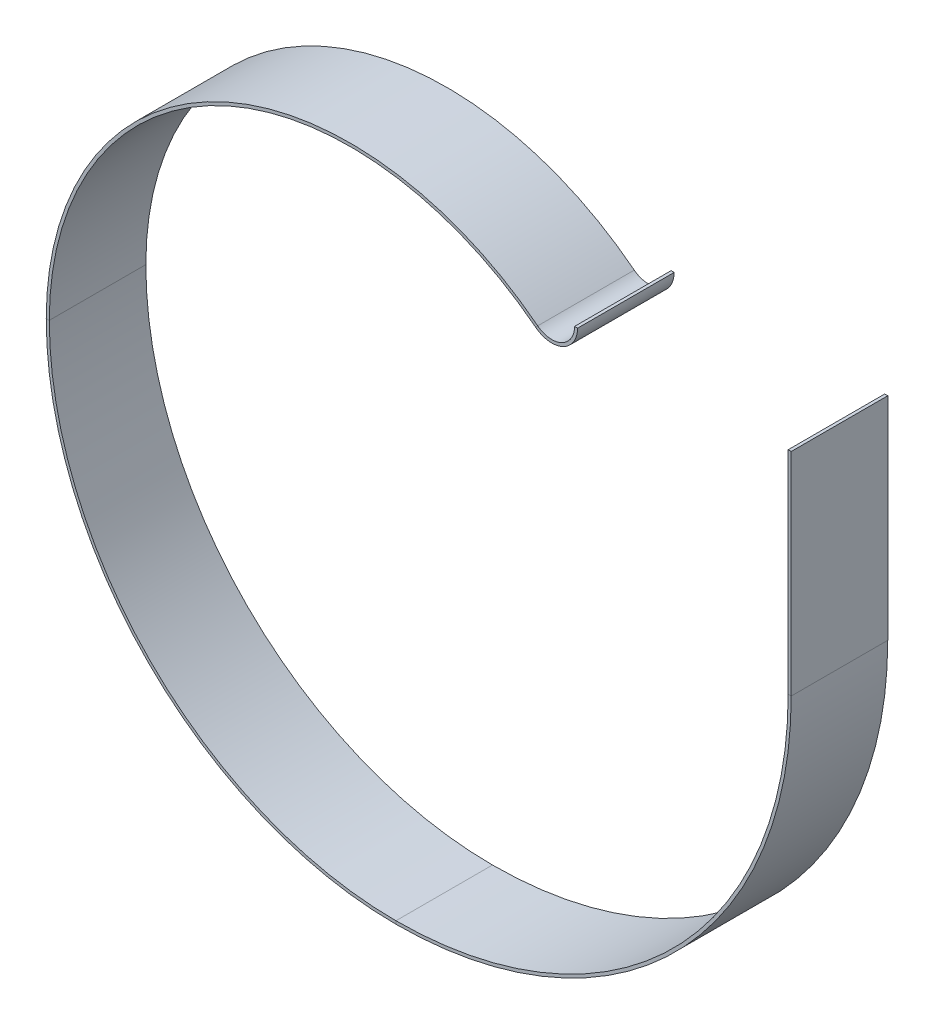
ISO-10303-21;
HEADER;
FILE_DESCRIPTION(('STEP AP214'),'2;1');
FILE_NAME('part.step','',(''),(''),'','','');
FILE_SCHEMA(('AUTOMOTIVE_DESIGN { 1 0 10303 214 1 1 1 1 }'));
ENDSEC;
DATA;
#1=APPLICATION_CONTEXT('core data for automotive mechanical design processes');
#2=APPLICATION_PROTOCOL_DEFINITION('international standard','automotive_design',2000,#1);
#3=PRODUCT_CONTEXT('',#1,'mechanical');
#4=PRODUCT('Part','Part','',(#3));
#5=PRODUCT_RELATED_PRODUCT_CATEGORY('part','',(#4));
#6=PRODUCT_DEFINITION_FORMATION('','',#4);
#7=PRODUCT_DEFINITION_CONTEXT('part definition',#1,'design');
#8=PRODUCT_DEFINITION('design','',#6,#7);
#9=PRODUCT_DEFINITION_SHAPE('','',#8);
#10=(LENGTH_UNIT() NAMED_UNIT(*) SI_UNIT(.MILLI.,.METRE.));
#11=(NAMED_UNIT(*) PLANE_ANGLE_UNIT() SI_UNIT($,.RADIAN.));
#12=(NAMED_UNIT(*) SI_UNIT($,.STERADIAN.) SOLID_ANGLE_UNIT());
#13=UNCERTAINTY_MEASURE_WITH_UNIT(LENGTH_MEASURE(1.E-05),#10,'distance_accuracy_value','');
#14=(GEOMETRIC_REPRESENTATION_CONTEXT(3) GLOBAL_UNCERTAINTY_ASSIGNED_CONTEXT((#13)) GLOBAL_UNIT_ASSIGNED_CONTEXT((#10,
#11,#12)) REPRESENTATION_CONTEXT('',''));
#15=CARTESIAN_POINT('',(0.,0.,0.));
#16=DIRECTION('',(0.,0.,1.));
#17=DIRECTION('',(1.,0.,0.));
#18=AXIS2_PLACEMENT_3D('',#15,#16,#17);
#19=CARTESIAN_POINT('',(546.,30.,63.5));
#20=DIRECTION('',(0.,0.,1.));
#21=DIRECTION('',(1.,0.,0.));
#22=AXIS2_PLACEMENT_3D('',#19,#20,#21);
#23=PLANE('',#22);
#24=DIRECTION('',(1.,0.,0.));
#25=VECTOR('',#24,1.);
#26=CARTESIAN_POINT('',(546.,30.,63.5));
#27=LINE('',#26,#25);
#28=CARTESIAN_POINT('',(546.,30.,63.5));
#29=VERTEX_POINT('',#28);
#30=CARTESIAN_POINT('',(550.,29.9999999999999,63.5));
#31=VERTEX_POINT('',#30);
#32=EDGE_CURVE('E11',#29,#31,#27,.T.);
#33=ORIENTED_EDGE('',*,*,#32,.F.);
#34=CARTESIAN_POINT('',(30.,30.,63.5));
#35=DIRECTION('',(0.,0.,1.));
#36=DIRECTION('',(1.,0.,0.));
#37=AXIS2_PLACEMENT_3D('',#34,#35,#36);
#38=CIRCLE('',#37,516.);
#39=CARTESIAN_POINT('',(29.9999999999999,-486.,63.5));
#40=VERTEX_POINT('',#39);
#41=EDGE_CURVE('E149',#29,#40,#38,.F.);
#42=ORIENTED_EDGE('',*,*,#41,.T.);
#43=DIRECTION('',(0.,-1.,0.));
#44=VECTOR('',#43,1.);
#45=CARTESIAN_POINT('',(29.9999999999999,-486.,63.5));
#46=LINE('',#45,#44);
#47=CARTESIAN_POINT('',(29.9999999999999,-490.,63.5));
#48=VERTEX_POINT('',#47);
#49=EDGE_CURVE('E134',#40,#48,#46,.T.);
#50=ORIENTED_EDGE('',*,*,#49,.T.);
#51=CARTESIAN_POINT('',(30.,30.,63.5));
#52=DIRECTION('',(0.,0.,-1.));
#53=DIRECTION('',(1.,0.,0.));
#54=AXIS2_PLACEMENT_3D('',#51,#52,#53);
#55=CIRCLE('',#54,520.);
#56=EDGE_CURVE('E251',#31,#48,#55,.T.);
#57=ORIENTED_EDGE('',*,*,#56,.F.);
#58=EDGE_LOOP('',(#33,#42,#50,#57));
#59=FACE_BOUND('',#58,.T.);
#60=ADVANCED_FACE('F37',(#59),#23,.T.);
#61=CARTESIAN_POINT('',(550.,29.9999999999999,-63.5));
#62=DIRECTION('',(0.,0.,-1.));
#63=DIRECTION('',(-1.,0.,0.));
#64=AXIS2_PLACEMENT_3D('',#61,#62,#63);
#65=PLANE('',#64);
#66=DIRECTION('',(-1.,0.,0.));
#67=VECTOR('',#66,1.);
#68=CARTESIAN_POINT('',(550.,29.9999999999999,-63.5));
#69=LINE('',#68,#67);
#70=CARTESIAN_POINT('',(550.,29.9999999999999,-63.5));
#71=VERTEX_POINT('',#70);
#72=CARTESIAN_POINT('',(546.,30.,-63.5));
#73=VERTEX_POINT('',#72);
#74=EDGE_CURVE('E45',#71,#73,#69,.T.);
#75=ORIENTED_EDGE('',*,*,#74,.F.);
#76=CARTESIAN_POINT('',(30.,30.,-63.5));
#77=DIRECTION('',(0.,0.,-1.));
#78=DIRECTION('',(1.,0.,0.));
#79=AXIS2_PLACEMENT_3D('',#76,#77,#78);
#80=CIRCLE('',#79,520.);
#81=CARTESIAN_POINT('',(29.9999999999999,-490.,-63.5));
#82=VERTEX_POINT('',#81);
#83=EDGE_CURVE('E188',#71,#82,#80,.T.);
#84=ORIENTED_EDGE('',*,*,#83,.T.);
#85=DIRECTION('',(0.,1.,0.));
#86=VECTOR('',#85,1.);
#87=CARTESIAN_POINT('',(29.9999999999999,-490.,-63.5));
#88=LINE('',#87,#86);
#89=CARTESIAN_POINT('',(29.9999999999999,-486.,-63.5));
#90=VERTEX_POINT('',#89);
#91=EDGE_CURVE('E146',#82,#90,#88,.T.);
#92=ORIENTED_EDGE('',*,*,#91,.T.);
#93=CARTESIAN_POINT('',(30.,30.,-63.5));
#94=DIRECTION('',(0.,0.,1.));
#95=DIRECTION('',(1.,0.,0.));
#96=AXIS2_PLACEMENT_3D('',#93,#94,#95);
#97=CIRCLE('',#96,516.);
#98=EDGE_CURVE('E161',#73,#90,#97,.F.);
#99=ORIENTED_EDGE('',*,*,#98,.F.);
#100=EDGE_LOOP('',(#75,#84,#92,#99));
#101=FACE_BOUND('',#100,.T.);
#102=ADVANCED_FACE('F244',(#101),#65,.T.);
#103=CARTESIAN_POINT('',(29.9999999999999,-486.,63.5));
#104=DIRECTION('',(0.,0.,1.));
#105=DIRECTION('',(1.,0.,0.));
#106=AXIS2_PLACEMENT_3D('',#103,#104,#105);
#107=PLANE('',#106);
#108=ORIENTED_EDGE('',*,*,#49,.F.);
#109=CARTESIAN_POINT('',(30.,-30.,63.5));
#110=DIRECTION('',(0.,0.,1.));
#111=DIRECTION('',(1.,0.,0.));
#112=AXIS2_PLACEMENT_3D('',#109,#110,#111);
#113=CIRCLE('',#112,456.);
#114=CARTESIAN_POINT('',(-426.,-30.,63.5));
#115=VERTEX_POINT('',#114);
#116=EDGE_CURVE('E138',#40,#115,#113,.F.);
#117=ORIENTED_EDGE('',*,*,#116,.T.);
#118=DIRECTION('',(-1.,0.,0.));
#119=VECTOR('',#118,1.);
#120=CARTESIAN_POINT('',(-426.,-30.,63.5));
#121=LINE('',#120,#119);
#122=CARTESIAN_POINT('',(-430.,-29.9999999999999,63.5));
#123=VERTEX_POINT('',#122);
#124=EDGE_CURVE('E232',#115,#123,#121,.T.);
#125=ORIENTED_EDGE('',*,*,#124,.T.);
#126=CARTESIAN_POINT('',(30.,-30.,63.5));
#127=DIRECTION('',(0.,0.,-1.));
#128=DIRECTION('',(1.,0.,0.));
#129=AXIS2_PLACEMENT_3D('',#126,#127,#128);
#130=CIRCLE('',#129,460.);
#131=EDGE_CURVE('E141',#48,#123,#130,.T.);
#132=ORIENTED_EDGE('',*,*,#131,.F.);
#133=EDGE_LOOP('',(#108,#117,#125,#132));
#134=FACE_BOUND('',#133,.T.);
#135=ADVANCED_FACE('F136',(#134),#107,.T.);
#136=CARTESIAN_POINT('',(29.9999999999999,-490.,-63.5));
#137=DIRECTION('',(0.,0.,-1.));
#138=DIRECTION('',(-1.,0.,0.));
#139=AXIS2_PLACEMENT_3D('',#136,#137,#138);
#140=PLANE('',#139);
#141=ORIENTED_EDGE('',*,*,#91,.F.);
#142=CARTESIAN_POINT('',(30.,-30.,-63.5));
#143=DIRECTION('',(0.,0.,-1.));
#144=DIRECTION('',(1.,0.,0.));
#145=AXIS2_PLACEMENT_3D('',#142,#143,#144);
#146=CIRCLE('',#145,460.);
#147=CARTESIAN_POINT('',(-430.,-29.9999999999999,-63.5));
#148=VERTEX_POINT('',#147);
#149=EDGE_CURVE('E186',#82,#148,#146,.T.);
#150=ORIENTED_EDGE('',*,*,#149,.T.);
#151=DIRECTION('',(1.,0.,0.));
#152=VECTOR('',#151,1.);
#153=CARTESIAN_POINT('',(-430.,-29.9999999999999,-63.5));
#154=LINE('',#153,#152);
#155=CARTESIAN_POINT('',(-426.,-30.,-63.5));
#156=VERTEX_POINT('',#155);
#157=EDGE_CURVE('E94',#148,#156,#154,.T.);
#158=ORIENTED_EDGE('',*,*,#157,.T.);
#159=CARTESIAN_POINT('',(30.,-30.,-63.5));
#160=DIRECTION('',(0.,0.,1.));
#161=DIRECTION('',(1.,0.,0.));
#162=AXIS2_PLACEMENT_3D('',#159,#160,#161);
#163=CIRCLE('',#162,456.);
#164=EDGE_CURVE('E201',#90,#156,#163,.F.);
#165=ORIENTED_EDGE('',*,*,#164,.F.);
#166=EDGE_LOOP('',(#141,#150,#158,#165));
#167=FACE_BOUND('',#166,.T.);
#168=ADVANCED_FACE('F246',(#167),#140,.T.);
#169=CARTESIAN_POINT('',(-426.,-30.,63.5));
#170=DIRECTION('',(0.,0.,1.));
#171=DIRECTION('',(1.,0.,0.));
#172=AXIS2_PLACEMENT_3D('',#169,#170,#171);
#173=PLANE('',#172);
#174=ORIENTED_EDGE('',*,*,#124,.F.);
#175=CARTESIAN_POINT('',(-30.,-30.,63.5));
#176=DIRECTION('',(0.,0.,1.));
#177=DIRECTION('',(1.,0.,0.));
#178=AXIS2_PLACEMENT_3D('',#175,#176,#177);
#179=CIRCLE('',#178,396.);
#180=CARTESIAN_POINT('',(214.046511627907,281.861027001211,63.5));
#181=VERTEX_POINT('',#180);
#182=EDGE_CURVE('E169',#115,#181,#179,.F.);
#183=ORIENTED_EDGE('',*,*,#182,.T.);
#184=DIRECTION('',(0.616279069767441,0.787527845962654,0.));
#185=VECTOR('',#184,1.);
#186=CARTESIAN_POINT('',(214.046511627907,281.861027001211,63.5));
#187=LINE('',#186,#185);
#188=CARTESIAN_POINT('',(216.511627906977,285.011138385061,63.5));
#189=VERTEX_POINT('',#188);
#190=EDGE_CURVE('E53',#181,#189,#187,.T.);
#191=ORIENTED_EDGE('',*,*,#190,.T.);
#192=CARTESIAN_POINT('',(-30.,-30.,63.5));
#193=DIRECTION('',(0.,0.,-1.));
#194=DIRECTION('',(1.,0.,0.));
#195=AXIS2_PLACEMENT_3D('',#192,#193,#194);
#196=CIRCLE('',#195,400.);
#197=EDGE_CURVE('E279',#123,#189,#196,.T.);
#198=ORIENTED_EDGE('',*,*,#197,.F.);
#199=EDGE_LOOP('',(#174,#183,#191,#198));
#200=FACE_BOUND('',#199,.T.);
#201=ADVANCED_FACE('F318',(#200),#173,.T.);
#202=CARTESIAN_POINT('',(-430.,-29.9999999999999,-63.5));
#203=DIRECTION('',(0.,0.,-1.));
#204=DIRECTION('',(-1.,0.,0.));
#205=AXIS2_PLACEMENT_3D('',#202,#203,#204);
#206=PLANE('',#205);
#207=ORIENTED_EDGE('',*,*,#157,.F.);
#208=CARTESIAN_POINT('',(-30.,-30.,-63.5));
#209=DIRECTION('',(0.,0.,-1.));
#210=DIRECTION('',(1.,0.,0.));
#211=AXIS2_PLACEMENT_3D('',#208,#209,#210);
#212=CIRCLE('',#211,400.);
#213=CARTESIAN_POINT('',(216.511627906977,285.011138385061,-63.5));
#214=VERTEX_POINT('',#213);
#215=EDGE_CURVE('E184',#148,#214,#212,.T.);
#216=ORIENTED_EDGE('',*,*,#215,.T.);
#217=DIRECTION('',(-0.616279069767441,-0.787527845962654,0.));
#218=VECTOR('',#217,1.);
#219=CARTESIAN_POINT('',(216.511627906977,285.011138385061,-63.5));
#220=LINE('',#219,#218);
#221=CARTESIAN_POINT('',(214.046511627907,281.861027001211,-63.5));
#222=VERTEX_POINT('',#221);
#223=EDGE_CURVE('E101',#214,#222,#220,.T.);
#224=ORIENTED_EDGE('',*,*,#223,.T.);
#225=CARTESIAN_POINT('',(-30.,-30.,-63.5));
#226=DIRECTION('',(0.,0.,1.));
#227=DIRECTION('',(1.,0.,0.));
#228=AXIS2_PLACEMENT_3D('',#225,#226,#227);
#229=CIRCLE('',#228,396.);
#230=EDGE_CURVE('E203',#156,#222,#229,.F.);
#231=ORIENTED_EDGE('',*,*,#230,.F.);
#232=EDGE_LOOP('',(#207,#216,#224,#231));
#233=FACE_BOUND('',#232,.T.);
#234=ADVANCED_FACE('F262',(#233),#206,.T.);
#235=CARTESIAN_POINT('',(214.046511627907,281.861027001211,63.5));
#236=DIRECTION('',(0.,0.,1.));
#237=DIRECTION('',(1.,0.,0.));
#238=AXIS2_PLACEMENT_3D('',#235,#236,#237);
#239=PLANE('',#238);
#240=ORIENTED_EDGE('',*,*,#190,.F.);
#241=CARTESIAN_POINT('',(235.,308.636973763941,63.5));
#242=DIRECTION('',(0.,0.,1.));
#243=DIRECTION('',(1.,0.,0.));
#244=AXIS2_PLACEMENT_3D('',#241,#242,#243);
#245=CIRCLE('',#244,34.);
#246=CARTESIAN_POINT('',(269.,308.636973763941,63.5));
#247=VERTEX_POINT('',#246);
#248=EDGE_CURVE('E107',#181,#247,#245,.T.);
#249=ORIENTED_EDGE('',*,*,#248,.T.);
#250=DIRECTION('',(1.,0.,0.));
#251=VECTOR('',#250,1.);
#252=CARTESIAN_POINT('',(265.,308.636973763941,63.5));
#253=LINE('',#252,#251);
#254=CARTESIAN_POINT('',(265.,308.636973763941,63.5));
#255=VERTEX_POINT('',#254);
#256=EDGE_CURVE('E275',#255,#247,#253,.T.);
#257=ORIENTED_EDGE('',*,*,#256,.F.);
#258=CARTESIAN_POINT('',(235.,308.636973763941,63.5));
#259=DIRECTION('',(0.,0.,1.));
#260=DIRECTION('',(1.,0.,0.));
#261=AXIS2_PLACEMENT_3D('',#258,#259,#260);
#262=CIRCLE('',#261,30.);
#263=EDGE_CURVE('E277',#189,#255,#262,.T.);
#264=ORIENTED_EDGE('',*,*,#263,.F.);
#265=EDGE_LOOP('',(#240,#249,#257,#264));
#266=FACE_BOUND('',#265,.T.);
#267=ADVANCED_FACE('F324',(#266),#239,.T.);
#268=CARTESIAN_POINT('',(216.511627906977,285.011138385061,-63.5));
#269=DIRECTION('',(0.,0.,-1.));
#270=DIRECTION('',(-1.,0.,0.));
#271=AXIS2_PLACEMENT_3D('',#268,#269,#270);
#272=PLANE('',#271);
#273=ORIENTED_EDGE('',*,*,#223,.F.);
#274=CARTESIAN_POINT('',(235.,308.636973763941,-63.5));
#275=DIRECTION('',(0.,0.,1.));
#276=DIRECTION('',(1.,0.,0.));
#277=AXIS2_PLACEMENT_3D('',#274,#275,#276);
#278=CIRCLE('',#277,30.);
#279=CARTESIAN_POINT('',(265.,308.636973763941,-63.5));
#280=VERTEX_POINT('',#279);
#281=EDGE_CURVE('E181',#214,#280,#278,.T.);
#282=ORIENTED_EDGE('',*,*,#281,.T.);
#283=DIRECTION('',(1.,0.,0.));
#284=VECTOR('',#283,1.);
#285=CARTESIAN_POINT('',(265.,308.636973763941,-63.5));
#286=LINE('',#285,#284);
#287=CARTESIAN_POINT('',(269.,308.636973763941,-63.5));
#288=VERTEX_POINT('',#287);
#289=EDGE_CURVE('E178',#280,#288,#286,.T.);
#290=ORIENTED_EDGE('',*,*,#289,.T.);
#291=CARTESIAN_POINT('',(235.,308.636973763941,-63.5));
#292=DIRECTION('',(0.,0.,1.));
#293=DIRECTION('',(1.,0.,0.));
#294=AXIS2_PLACEMENT_3D('',#291,#292,#293);
#295=CIRCLE('',#294,34.);
#296=EDGE_CURVE('E175',#222,#288,#295,.T.);
#297=ORIENTED_EDGE('',*,*,#296,.F.);
#298=EDGE_LOOP('',(#273,#282,#290,#297));
#299=FACE_BOUND('',#298,.T.);
#300=ADVANCED_FACE('F270',(#299),#272,.T.);
#301=CARTESIAN_POINT('',(235.,308.636973763941,63.5));
#302=DIRECTION('',(0.,0.,-1.));
#303=DIRECTION('',(-1.,0.,0.));
#304=AXIS2_PLACEMENT_3D('',#301,#302,#303);
#305=CYLINDRICAL_SURFACE('',#304,34.);
#306=ORIENTED_EDGE('',*,*,#296,.T.);
#307=DIRECTION('',(0.,0.,-1.));
#308=VECTOR('',#307,1.);
#309=CARTESIAN_POINT('',(269.,308.636973763941,63.5));
#310=LINE('',#309,#308);
#311=EDGE_CURVE('E227',#247,#288,#310,.T.);
#312=ORIENTED_EDGE('',*,*,#311,.F.);
#313=ORIENTED_EDGE('',*,*,#248,.F.);
#314=DIRECTION('',(0.,0.,-1.));
#315=VECTOR('',#314,1.);
#316=CARTESIAN_POINT('',(214.046511627907,281.861027001211,63.5));
#317=LINE('',#316,#315);
#318=EDGE_CURVE('E171',#181,#222,#317,.T.);
#319=ORIENTED_EDGE('',*,*,#318,.T.);
#320=EDGE_LOOP('',(#306,#312,#313,#319));
#321=FACE_BOUND('',#320,.T.);
#322=ADVANCED_FACE('F268',(#321),#305,.T.);
#323=CARTESIAN_POINT('',(265.,308.636973763941,63.5));
#324=DIRECTION('',(0.,1.,0.));
#325=DIRECTION('',(0.,0.,1.));
#326=AXIS2_PLACEMENT_3D('',#323,#324,#325);
#327=PLANE('',#326);
#328=ORIENTED_EDGE('',*,*,#289,.F.);
#329=DIRECTION('',(0.,0.,-1.));
#330=VECTOR('',#329,1.);
#331=CARTESIAN_POINT('',(265.,308.636973763941,63.5));
#332=LINE('',#331,#330);
#333=EDGE_CURVE('E225',#255,#280,#332,.T.);
#334=ORIENTED_EDGE('',*,*,#333,.F.);
#335=ORIENTED_EDGE('',*,*,#256,.T.);
#336=ORIENTED_EDGE('',*,*,#311,.T.);
#337=EDGE_LOOP('',(#328,#334,#335,#336));
#338=FACE_BOUND('',#337,.T.);
#339=ADVANCED_FACE('F273',(#338),#327,.T.);
#340=CARTESIAN_POINT('',(235.,308.636973763941,63.5));
#341=DIRECTION('',(0.,0.,-1.));
#342=DIRECTION('',(-1.,0.,0.));
#343=AXIS2_PLACEMENT_3D('',#340,#341,#342);
#344=CYLINDRICAL_SURFACE('',#343,30.);
#345=ORIENTED_EDGE('',*,*,#281,.F.);
#346=DIRECTION('',(0.,0.,-1.));
#347=VECTOR('',#346,1.);
#348=CARTESIAN_POINT('',(216.511627906977,285.011138385061,63.5));
#349=LINE('',#348,#347);
#350=EDGE_CURVE('E222',#189,#214,#349,.T.);
#351=ORIENTED_EDGE('',*,*,#350,.F.);
#352=ORIENTED_EDGE('',*,*,#263,.T.);
#353=ORIENTED_EDGE('',*,*,#333,.T.);
#354=EDGE_LOOP('',(#345,#351,#352,#353));
#355=FACE_BOUND('',#354,.T.);
#356=ADVANCED_FACE('F333',(#355),#344,.F.);
#357=CARTESIAN_POINT('',(-30.,-30.,63.5));
#358=DIRECTION('',(0.,0.,-1.));
#359=DIRECTION('',(-1.,0.,0.));
#360=AXIS2_PLACEMENT_3D('',#357,#358,#359);
#361=CYLINDRICAL_SURFACE('',#360,400.);
#362=ORIENTED_EDGE('',*,*,#215,.F.);
#363=DIRECTION('',(0.,0.,-1.));
#364=VECTOR('',#363,1.);
#365=CARTESIAN_POINT('',(-430.,-29.9999999999999,63.5));
#366=LINE('',#365,#364);
#367=EDGE_CURVE('E219',#123,#148,#366,.T.);
#368=ORIENTED_EDGE('',*,*,#367,.F.);
#369=ORIENTED_EDGE('',*,*,#197,.T.);
#370=ORIENTED_EDGE('',*,*,#350,.T.);
#371=EDGE_LOOP('',(#362,#368,#369,#370));
#372=FACE_BOUND('',#371,.T.);
#373=ADVANCED_FACE('F259',(#372),#361,.T.);
#374=CARTESIAN_POINT('',(30.,-30.,63.5));
#375=DIRECTION('',(0.,0.,-1.));
#376=DIRECTION('',(-1.,0.,0.));
#377=AXIS2_PLACEMENT_3D('',#374,#375,#376);
#378=CYLINDRICAL_SURFACE('',#377,460.);
#379=ORIENTED_EDGE('',*,*,#149,.F.);
#380=DIRECTION('',(0.,0.,-1.));
#381=VECTOR('',#380,1.);
#382=CARTESIAN_POINT('',(29.9999999999999,-490.,63.5));
#383=LINE('',#382,#381);
#384=EDGE_CURVE('E216',#48,#82,#383,.T.);
#385=ORIENTED_EDGE('',*,*,#384,.F.);
#386=ORIENTED_EDGE('',*,*,#131,.T.);
#387=ORIENTED_EDGE('',*,*,#367,.T.);
#388=EDGE_LOOP('',(#379,#385,#386,#387));
#389=FACE_BOUND('',#388,.T.);
#390=ADVANCED_FACE('F253',(#389),#378,.T.);
#391=CARTESIAN_POINT('',(30.,30.,63.5));
#392=DIRECTION('',(0.,0.,-1.));
#393=DIRECTION('',(-1.,0.,0.));
#394=AXIS2_PLACEMENT_3D('',#391,#392,#393);
#395=CYLINDRICAL_SURFACE('',#394,520.);
#396=ORIENTED_EDGE('',*,*,#83,.F.);
#397=DIRECTION('',(0.,0.,-1.));
#398=VECTOR('',#397,1.);
#399=CARTESIAN_POINT('',(550.,29.9999999999999,63.5));
#400=LINE('',#399,#398);
#401=EDGE_CURVE('E213',#31,#71,#400,.T.);
#402=ORIENTED_EDGE('',*,*,#401,.F.);
#403=ORIENTED_EDGE('',*,*,#56,.T.);
#404=ORIENTED_EDGE('',*,*,#384,.T.);
#405=EDGE_LOOP('',(#396,#402,#403,#404));
#406=FACE_BOUND('',#405,.T.);
#407=ADVANCED_FACE('F249',(#406),#395,.T.);
#408=CARTESIAN_POINT('',(550.,29.9999999999999,63.5));
#409=DIRECTION('',(1.,0.,0.));
#410=DIRECTION('',(0.,0.,-1.));
#411=AXIS2_PLACEMENT_3D('',#408,#409,#410);
#412=PLANE('',#411);
#413=DIRECTION('',(0.,-1.,0.));
#414=VECTOR('',#413,1.);
#415=CARTESIAN_POINT('',(550.,29.9999999999999,-63.5));
#416=LINE('',#415,#414);
#417=CARTESIAN_POINT('',(550.,308.636973763941,-63.5));
#418=VERTEX_POINT('',#417);
#419=EDGE_CURVE('E191',#418,#71,#416,.T.);
#420=ORIENTED_EDGE('',*,*,#419,.F.);
#421=DIRECTION('',(0.,0.,-1.));
#422=VECTOR('',#421,1.);
#423=CARTESIAN_POINT('',(550.,308.636973763941,63.5));
#424=LINE('',#423,#422);
#425=CARTESIAN_POINT('',(550.,308.636973763941,63.5));
#426=VERTEX_POINT('',#425);
#427=EDGE_CURVE('E211',#426,#418,#424,.T.);
#428=ORIENTED_EDGE('',*,*,#427,.F.);
#429=DIRECTION('',(0.,-1.,0.));
#430=VECTOR('',#429,1.);
#431=CARTESIAN_POINT('',(550.,29.9999999999999,63.5));
#432=LINE('',#431,#430);
#433=EDGE_CURVE('E286',#426,#31,#432,.T.);
#434=ORIENTED_EDGE('',*,*,#433,.T.);
#435=ORIENTED_EDGE('',*,*,#401,.T.);
#436=EDGE_LOOP('',(#420,#428,#434,#435));
#437=FACE_BOUND('',#436,.T.);
#438=ADVANCED_FACE('F298',(#437),#412,.T.);
#439=CARTESIAN_POINT('',(546.,308.636973763941,63.5));
#440=DIRECTION('',(0.,1.,0.));
#441=DIRECTION('',(0.,0.,1.));
#442=AXIS2_PLACEMENT_3D('',#439,#440,#441);
#443=PLANE('',#442);
#444=DIRECTION('',(1.,0.,0.));
#445=VECTOR('',#444,1.);
#446=CARTESIAN_POINT('',(546.,308.636973763941,-63.5));
#447=LINE('',#446,#445);
#448=CARTESIAN_POINT('',(546.,308.636973763941,-63.5));
#449=VERTEX_POINT('',#448);
#450=EDGE_CURVE('E194',#449,#418,#447,.T.);
#451=ORIENTED_EDGE('',*,*,#450,.F.);
#452=DIRECTION('',(0.,0.,-1.));
#453=VECTOR('',#452,1.);
#454=CARTESIAN_POINT('',(546.,308.636973763941,63.5));
#455=LINE('',#454,#453);
#456=CARTESIAN_POINT('',(546.,308.636973763941,63.5));
#457=VERTEX_POINT('',#456);
#458=EDGE_CURVE('E209',#457,#449,#455,.T.);
#459=ORIENTED_EDGE('',*,*,#458,.F.);
#460=DIRECTION('',(1.,0.,0.));
#461=VECTOR('',#460,1.);
#462=CARTESIAN_POINT('',(546.,308.636973763941,63.5));
#463=LINE('',#462,#461);
#464=EDGE_CURVE('E289',#457,#426,#463,.T.);
#465=ORIENTED_EDGE('',*,*,#464,.T.);
#466=ORIENTED_EDGE('',*,*,#427,.T.);
#467=EDGE_LOOP('',(#451,#459,#465,#466));
#468=FACE_BOUND('',#467,.T.);
#469=ADVANCED_FACE('F296',(#468),#443,.T.);
#470=CARTESIAN_POINT('',(546.,29.9999999999999,63.5));
#471=DIRECTION('',(1.,0.,0.));
#472=DIRECTION('',(0.,0.,-1.));
#473=AXIS2_PLACEMENT_3D('',#470,#471,#472);
#474=PLANE('',#473);
#475=DIRECTION('',(0.,1.,0.));
#476=VECTOR('',#475,1.);
#477=CARTESIAN_POINT('',(546.,29.9999999999999,-63.5));
#478=LINE('',#477,#476);
#479=EDGE_CURVE('E197',#449,#73,#478,.F.);
#480=ORIENTED_EDGE('',*,*,#479,.T.);
#481=DIRECTION('',(0.,0.,-1.));
#482=VECTOR('',#481,1.);
#483=CARTESIAN_POINT('',(546.,30.,63.5));
#484=LINE('',#483,#482);
#485=EDGE_CURVE('E163',#29,#73,#484,.T.);
#486=ORIENTED_EDGE('',*,*,#485,.F.);
#487=DIRECTION('',(0.,1.,0.));
#488=VECTOR('',#487,1.);
#489=CARTESIAN_POINT('',(546.,29.9999999999999,63.5));
#490=LINE('',#489,#488);
#491=EDGE_CURVE('E154',#457,#29,#490,.F.);
#492=ORIENTED_EDGE('',*,*,#491,.F.);
#493=ORIENTED_EDGE('',*,*,#458,.T.);
#494=EDGE_LOOP('',(#480,#486,#492,#493));
#495=FACE_BOUND('',#494,.T.);
#496=ADVANCED_FACE('F242',(#495),#474,.F.);
#497=CARTESIAN_POINT('',(30.,30.,63.5));
#498=DIRECTION('',(0.,0.,-1.));
#499=DIRECTION('',(-1.,0.,0.));
#500=AXIS2_PLACEMENT_3D('',#497,#498,#499);
#501=CYLINDRICAL_SURFACE('',#500,516.);
#502=ORIENTED_EDGE('',*,*,#98,.T.);
#503=DIRECTION('',(0.,0.,-1.));
#504=VECTOR('',#503,1.);
#505=CARTESIAN_POINT('',(29.9999999999999,-486.,63.5));
#506=LINE('',#505,#504);
#507=EDGE_CURVE('E158',#40,#90,#506,.T.);
#508=ORIENTED_EDGE('',*,*,#507,.F.);
#509=ORIENTED_EDGE('',*,*,#41,.F.);
#510=ORIENTED_EDGE('',*,*,#485,.T.);
#511=EDGE_LOOP('',(#502,#508,#509,#510));
#512=FACE_BOUND('',#511,.T.);
#513=ADVANCED_FACE('F159',(#512),#501,.F.);
#514=CARTESIAN_POINT('',(30.,-30.,63.5));
#515=DIRECTION('',(0.,0.,-1.));
#516=DIRECTION('',(-1.,0.,0.));
#517=AXIS2_PLACEMENT_3D('',#514,#515,#516);
#518=CYLINDRICAL_SURFACE('',#517,456.);
#519=ORIENTED_EDGE('',*,*,#164,.T.);
#520=DIRECTION('',(0.,0.,-1.));
#521=VECTOR('',#520,1.);
#522=CARTESIAN_POINT('',(-426.,-30.,63.5));
#523=LINE('',#522,#521);
#524=EDGE_CURVE('E164',#115,#156,#523,.T.);
#525=ORIENTED_EDGE('',*,*,#524,.F.);
#526=ORIENTED_EDGE('',*,*,#116,.F.);
#527=ORIENTED_EDGE('',*,*,#507,.T.);
#528=EDGE_LOOP('',(#519,#525,#526,#527));
#529=FACE_BOUND('',#528,.T.);
#530=ADVANCED_FACE('F166',(#529),#518,.F.);
#531=CARTESIAN_POINT('',(-30.,-30.,63.5));
#532=DIRECTION('',(0.,0.,-1.));
#533=DIRECTION('',(-1.,0.,0.));
#534=AXIS2_PLACEMENT_3D('',#531,#532,#533);
#535=CYLINDRICAL_SURFACE('',#534,396.);
#536=ORIENTED_EDGE('',*,*,#230,.T.);
#537=ORIENTED_EDGE('',*,*,#318,.F.);
#538=ORIENTED_EDGE('',*,*,#182,.F.);
#539=ORIENTED_EDGE('',*,*,#524,.T.);
#540=EDGE_LOOP('',(#536,#537,#538,#539));
#541=FACE_BOUND('',#540,.T.);
#542=ADVANCED_FACE('F265',(#541),#535,.F.);
#543=CARTESIAN_POINT('',(235.,308.636973763941,63.5));
#544=DIRECTION('',(0.,0.,1.));
#545=DIRECTION('',(1.,0.,0.));
#546=AXIS2_PLACEMENT_3D('',#543,#544,#545);
#547=PLANE('',#546);
#548=ORIENTED_EDGE('',*,*,#491,.T.);
#549=ORIENTED_EDGE('',*,*,#32,.T.);
#550=ORIENTED_EDGE('',*,*,#433,.F.);
#551=ORIENTED_EDGE('',*,*,#464,.F.);
#552=EDGE_LOOP('',(#548,#549,#550,#551));
#553=FACE_BOUND('',#552,.T.);
#554=ADVANCED_FACE('F293',(#553),#547,.T.);
#555=CARTESIAN_POINT('',(235.,308.636973763941,-63.5));
#556=DIRECTION('',(0.,0.,1.));
#557=DIRECTION('',(1.,0.,0.));
#558=AXIS2_PLACEMENT_3D('',#555,#556,#557);
#559=PLANE('',#558);
#560=ORIENTED_EDGE('',*,*,#419,.T.);
#561=ORIENTED_EDGE('',*,*,#74,.T.);
#562=ORIENTED_EDGE('',*,*,#479,.F.);
#563=ORIENTED_EDGE('',*,*,#450,.T.);
#564=EDGE_LOOP('',(#560,#561,#562,#563));
#565=FACE_BOUND('',#564,.T.);
#566=ADVANCED_FACE('F236',(#565),#559,.F.);
#567=CLOSED_SHELL('',(#60,#102,#135,#168,#201,#234,#267,#300,#322,#339,#356,#373,#390,#407,#438,
#469,#496,#513,#530,#542,#554,#566));
#568=MANIFOLD_SOLID_BREP('B2',#567);
#569=ADVANCED_BREP_SHAPE_REPRESENTATION('',(#18,#568),#14);
#570=SHAPE_DEFINITION_REPRESENTATION(#9,#569);
ENDSEC;
END-ISO-10303-21;
